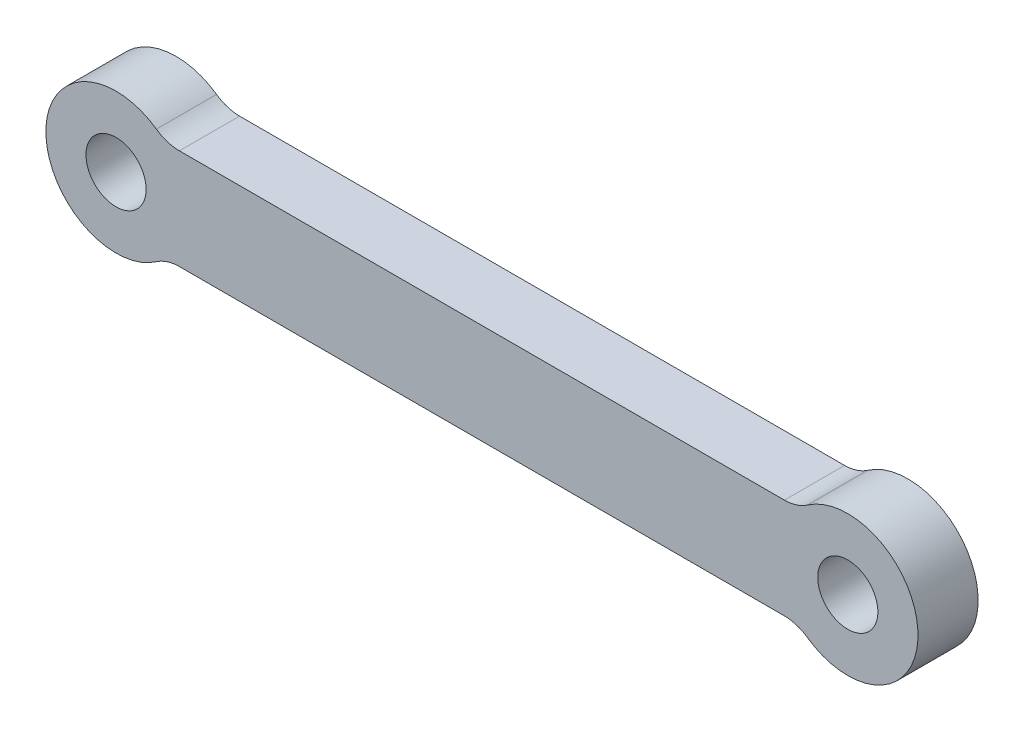
ISO-10303-21;
HEADER;
FILE_DESCRIPTION(('STEP AP214'),'2;1');
FILE_NAME('part.step','',(''),(''),'','','');
FILE_SCHEMA(('AUTOMOTIVE_DESIGN { 1 0 10303 214 1 1 1 1 }'));
ENDSEC;
DATA;
#1=APPLICATION_CONTEXT('core data for automotive mechanical design processes');
#2=APPLICATION_PROTOCOL_DEFINITION('international standard','automotive_design',2000,#1);
#3=PRODUCT_CONTEXT('',#1,'mechanical');
#4=PRODUCT('Part','Part','',(#3));
#5=PRODUCT_RELATED_PRODUCT_CATEGORY('part','',(#4));
#6=PRODUCT_DEFINITION_FORMATION('','',#4);
#7=PRODUCT_DEFINITION_CONTEXT('part definition',#1,'design');
#8=PRODUCT_DEFINITION('design','',#6,#7);
#9=PRODUCT_DEFINITION_SHAPE('','',#8);
#10=(LENGTH_UNIT() NAMED_UNIT(*) SI_UNIT(.MILLI.,.METRE.));
#11=(NAMED_UNIT(*) PLANE_ANGLE_UNIT() SI_UNIT($,.RADIAN.));
#12=(NAMED_UNIT(*) SI_UNIT($,.STERADIAN.) SOLID_ANGLE_UNIT());
#13=UNCERTAINTY_MEASURE_WITH_UNIT(LENGTH_MEASURE(1.E-05),#10,'distance_accuracy_value','');
#14=(GEOMETRIC_REPRESENTATION_CONTEXT(3) GLOBAL_UNCERTAINTY_ASSIGNED_CONTEXT((#13)) GLOBAL_UNIT_ASSIGNED_CONTEXT((#10,
#11,#12)) REPRESENTATION_CONTEXT('',''));
#15=CARTESIAN_POINT('',(0.,0.,0.));
#16=DIRECTION('',(0.,0.,1.));
#17=DIRECTION('',(1.,0.,0.));
#18=AXIS2_PLACEMENT_3D('',#15,#16,#17);
#19=CARTESIAN_POINT('',(33.3377223398316,-4.5,3.));
#20=DIRECTION('',(0.,0.,-1.));
#21=DIRECTION('',(-1.,0.,0.));
#22=AXIS2_PLACEMENT_3D('',#19,#20,#21);
#23=PLANE('',#22);
#24=CARTESIAN_POINT('',(33.3377223398316,-4.5,3.));
#25=DIRECTION('',(0.,0.,-1.));
#26=DIRECTION('',(-1.,0.,0.));
#27=AXIS2_PLACEMENT_3D('',#24,#25,#26);
#28=CIRCLE('',#27,2.);
#29=CARTESIAN_POINT('',(33.3377223398316,-2.5,3.));
#30=VERTEX_POINT('',#29);
#31=CARTESIAN_POINT('',(34.4876414889838,-2.86363636363636,3.));
#32=VERTEX_POINT('',#31);
#33=EDGE_CURVE('E146',#30,#32,#28,.T.);
#34=ORIENTED_EDGE('',*,*,#33,.T.);
#35=CARTESIAN_POINT('',(36.5,0.,3.));
#36=DIRECTION('',(0.,0.,1.));
#37=DIRECTION('',(-1.,0.,0.));
#38=AXIS2_PLACEMENT_3D('',#35,#36,#37);
#39=CIRCLE('',#38,3.5);
#40=CARTESIAN_POINT('',(34.4876414889838,2.86363636363637,3.));
#41=VERTEX_POINT('',#40);
#42=EDGE_CURVE('E94',#32,#41,#39,.T.);
#43=ORIENTED_EDGE('',*,*,#42,.T.);
#44=CARTESIAN_POINT('',(33.3377223398316,4.5,3.));
#45=DIRECTION('',(0.,0.,-1.));
#46=DIRECTION('',(-1.,0.,0.));
#47=AXIS2_PLACEMENT_3D('',#44,#45,#46);
#48=CIRCLE('',#47,1.99999999999999);
#49=CARTESIAN_POINT('',(33.3377223398316,2.5,3.));
#50=VERTEX_POINT('',#49);
#51=EDGE_CURVE('E161',#41,#50,#48,.T.);
#52=ORIENTED_EDGE('',*,*,#51,.T.);
#53=DIRECTION('',(-1.,0.,0.));
#54=VECTOR('',#53,1.);
#55=CARTESIAN_POINT('',(3.16227766016838,2.5,3.));
#56=LINE('',#55,#54);
#57=CARTESIAN_POINT('',(3.16227766016838,2.5,3.));
#58=VERTEX_POINT('',#57);
#59=EDGE_CURVE('E174',#50,#58,#56,.T.);
#60=ORIENTED_EDGE('',*,*,#59,.T.);
#61=CARTESIAN_POINT('',(3.16227766016838,4.5,3.));
#62=DIRECTION('',(0.,0.,-1.));
#63=DIRECTION('',(-1.,0.,0.));
#64=AXIS2_PLACEMENT_3D('',#61,#62,#63);
#65=CIRCLE('',#64,2.);
#66=CARTESIAN_POINT('',(2.01235851101624,2.86363636363636,3.));
#67=VERTEX_POINT('',#66);
#68=EDGE_CURVE('E113',#58,#67,#65,.T.);
#69=ORIENTED_EDGE('',*,*,#68,.T.);
#70=CARTESIAN_POINT('',(0.,0.,3.));
#71=DIRECTION('',(0.,0.,1.));
#72=DIRECTION('',(1.,0.,0.));
#73=AXIS2_PLACEMENT_3D('',#70,#71,#72);
#74=CIRCLE('',#73,3.5);
#75=CARTESIAN_POINT('',(2.01235851101624,-2.86363636363636,3.));
#76=VERTEX_POINT('',#75);
#77=EDGE_CURVE('E107',#67,#76,#74,.T.);
#78=ORIENTED_EDGE('',*,*,#77,.T.);
#79=CARTESIAN_POINT('',(3.16227766016838,-4.5,3.));
#80=DIRECTION('',(0.,0.,-1.));
#81=DIRECTION('',(1.,0.,0.));
#82=AXIS2_PLACEMENT_3D('',#79,#80,#81);
#83=CIRCLE('',#82,2.);
#84=CARTESIAN_POINT('',(3.16227766016838,-2.5,3.));
#85=VERTEX_POINT('',#84);
#86=EDGE_CURVE('E111',#76,#85,#83,.T.);
#87=ORIENTED_EDGE('',*,*,#86,.T.);
#88=DIRECTION('',(1.,0.,0.));
#89=VECTOR('',#88,1.);
#90=CARTESIAN_POINT('',(3.16227766016838,-2.5,3.));
#91=LINE('',#90,#89);
#92=EDGE_CURVE('E51',#85,#30,#91,.T.);
#93=ORIENTED_EDGE('',*,*,#92,.T.);
#94=EDGE_LOOP('',(#34,#43,#52,#60,#69,#78,#87,#93));
#95=FACE_BOUND('',#94,.T.);
#96=CARTESIAN_POINT('',(0.,0.,3.));
#97=DIRECTION('',(0.,0.,1.));
#98=DIRECTION('',(1.,0.,0.));
#99=AXIS2_PLACEMENT_3D('',#96,#97,#98);
#100=CIRCLE('',#99,1.5);
#101=CARTESIAN_POINT('',(1.5,0.,3.));
#102=VERTEX_POINT('',#101);
#103=EDGE_CURVE('E135',#102,#102,#100,.T.);
#104=ORIENTED_EDGE('',*,*,#103,.F.);
#105=EDGE_LOOP('',(#104));
#106=FACE_BOUND('',#105,.T.);
#107=CARTESIAN_POINT('',(36.5,0.,3.));
#108=DIRECTION('',(0.,0.,1.));
#109=DIRECTION('',(1.,0.,0.));
#110=AXIS2_PLACEMENT_3D('',#107,#108,#109);
#111=CIRCLE('',#110,1.5);
#112=CARTESIAN_POINT('',(38.,0.,3.));
#113=VERTEX_POINT('',#112);
#114=EDGE_CURVE('E183',#113,#113,#111,.T.);
#115=ORIENTED_EDGE('',*,*,#114,.F.);
#116=EDGE_LOOP('',(#115));
#117=FACE_BOUND('',#116,.T.);
#118=ADVANCED_FACE('F34',(#95,#106,#117),#23,.F.);
#119=CARTESIAN_POINT('',(33.3377223398316,-4.5,0.));
#120=DIRECTION('',(0.,0.,-1.));
#121=DIRECTION('',(-1.,0.,0.));
#122=AXIS2_PLACEMENT_3D('',#119,#120,#121);
#123=PLANE('',#122);
#124=CARTESIAN_POINT('',(0.,0.,0.));
#125=DIRECTION('',(0.,0.,1.));
#126=DIRECTION('',(1.,0.,0.));
#127=AXIS2_PLACEMENT_3D('',#124,#125,#126);
#128=CIRCLE('',#127,1.5);
#129=CARTESIAN_POINT('',(1.5,0.,0.));
#130=VERTEX_POINT('',#129);
#131=EDGE_CURVE('E180',#130,#130,#128,.T.);
#132=ORIENTED_EDGE('',*,*,#131,.T.);
#133=EDGE_LOOP('',(#132));
#134=FACE_BOUND('',#133,.T.);
#135=CARTESIAN_POINT('',(33.3377223398316,-4.5,0.));
#136=DIRECTION('',(0.,0.,-1.));
#137=DIRECTION('',(-1.,0.,0.));
#138=AXIS2_PLACEMENT_3D('',#135,#136,#137);
#139=CIRCLE('',#138,2.);
#140=CARTESIAN_POINT('',(33.3377223398316,-2.5,0.));
#141=VERTEX_POINT('',#140);
#142=CARTESIAN_POINT('',(34.4876414889838,-2.86363636363636,0.));
#143=VERTEX_POINT('',#142);
#144=EDGE_CURVE('E131',#141,#143,#139,.T.);
#145=ORIENTED_EDGE('',*,*,#144,.F.);
#146=DIRECTION('',(1.,0.,0.));
#147=VECTOR('',#146,1.);
#148=CARTESIAN_POINT('',(3.16227766016838,-2.5,0.));
#149=LINE('',#148,#147);
#150=CARTESIAN_POINT('',(3.16227766016838,-2.5,0.));
#151=VERTEX_POINT('',#150);
#152=EDGE_CURVE('E86',#151,#141,#149,.T.);
#153=ORIENTED_EDGE('',*,*,#152,.F.);
#154=CARTESIAN_POINT('',(3.16227766016838,-4.5,0.));
#155=DIRECTION('',(0.,0.,-1.));
#156=DIRECTION('',(1.,0.,0.));
#157=AXIS2_PLACEMENT_3D('',#154,#155,#156);
#158=CIRCLE('',#157,2.);
#159=CARTESIAN_POINT('',(2.01235851101624,-2.86363636363636,0.));
#160=VERTEX_POINT('',#159);
#161=EDGE_CURVE('E80',#160,#151,#158,.T.);
#162=ORIENTED_EDGE('',*,*,#161,.F.);
#163=CARTESIAN_POINT('',(0.,0.,0.));
#164=DIRECTION('',(0.,0.,1.));
#165=DIRECTION('',(1.,0.,0.));
#166=AXIS2_PLACEMENT_3D('',#163,#164,#165);
#167=CIRCLE('',#166,3.5);
#168=CARTESIAN_POINT('',(2.01235851101624,2.86363636363636,0.));
#169=VERTEX_POINT('',#168);
#170=EDGE_CURVE('E121',#169,#160,#167,.T.);
#171=ORIENTED_EDGE('',*,*,#170,.F.);
#172=CARTESIAN_POINT('',(3.16227766016838,4.5,0.));
#173=DIRECTION('',(0.,0.,-1.));
#174=DIRECTION('',(-1.,0.,0.));
#175=AXIS2_PLACEMENT_3D('',#172,#173,#174);
#176=CIRCLE('',#175,2.);
#177=CARTESIAN_POINT('',(3.16227766016838,2.5,0.));
#178=VERTEX_POINT('',#177);
#179=EDGE_CURVE('E141',#178,#169,#176,.T.);
#180=ORIENTED_EDGE('',*,*,#179,.F.);
#181=DIRECTION('',(-1.,0.,0.));
#182=VECTOR('',#181,1.);
#183=CARTESIAN_POINT('',(3.16227766016838,2.5,0.));
#184=LINE('',#183,#182);
#185=CARTESIAN_POINT('',(33.3377223398316,2.5,0.));
#186=VERTEX_POINT('',#185);
#187=EDGE_CURVE('E139',#186,#178,#184,.T.);
#188=ORIENTED_EDGE('',*,*,#187,.F.);
#189=CARTESIAN_POINT('',(33.3377223398316,4.5,0.));
#190=DIRECTION('',(0.,0.,-1.));
#191=DIRECTION('',(-1.,0.,0.));
#192=AXIS2_PLACEMENT_3D('',#189,#190,#191);
#193=CIRCLE('',#192,1.99999999999999);
#194=CARTESIAN_POINT('',(34.4876414889838,2.86363636363637,0.));
#195=VERTEX_POINT('',#194);
#196=EDGE_CURVE('E137',#195,#186,#193,.T.);
#197=ORIENTED_EDGE('',*,*,#196,.F.);
#198=CARTESIAN_POINT('',(36.5,0.,0.));
#199=DIRECTION('',(0.,0.,1.));
#200=DIRECTION('',(-1.,0.,0.));
#201=AXIS2_PLACEMENT_3D('',#198,#199,#200);
#202=CIRCLE('',#201,3.5);
#203=EDGE_CURVE('E134',#143,#195,#202,.T.);
#204=ORIENTED_EDGE('',*,*,#203,.F.);
#205=EDGE_LOOP('',(#145,#153,#162,#171,#180,#188,#197,#204));
#206=FACE_BOUND('',#205,.T.);
#207=CARTESIAN_POINT('',(36.5,0.,0.));
#208=DIRECTION('',(0.,0.,1.));
#209=DIRECTION('',(1.,0.,0.));
#210=AXIS2_PLACEMENT_3D('',#207,#208,#209);
#211=CIRCLE('',#210,1.5);
#212=CARTESIAN_POINT('',(38.,0.,0.));
#213=VERTEX_POINT('',#212);
#214=EDGE_CURVE('E186',#213,#213,#211,.T.);
#215=ORIENTED_EDGE('',*,*,#214,.T.);
#216=EDGE_LOOP('',(#215));
#217=FACE_BOUND('',#216,.T.);
#218=ADVANCED_FACE('F165',(#134,#206,#217),#123,.T.);
#219=CARTESIAN_POINT('',(33.3377223398316,-4.5,3.));
#220=DIRECTION('',(0.,0.,-1.));
#221=DIRECTION('',(-1.,0.,0.));
#222=AXIS2_PLACEMENT_3D('',#219,#220,#221);
#223=CYLINDRICAL_SURFACE('',#222,2.);
#224=ORIENTED_EDGE('',*,*,#144,.T.);
#225=DIRECTION('',(0.,0.,-1.));
#226=VECTOR('',#225,1.);
#227=CARTESIAN_POINT('',(34.4876414889838,-2.86363636363636,3.));
#228=LINE('',#227,#226);
#229=EDGE_CURVE('E11',#32,#143,#228,.T.);
#230=ORIENTED_EDGE('',*,*,#229,.F.);
#231=ORIENTED_EDGE('',*,*,#33,.F.);
#232=DIRECTION('',(0.,0.,-1.));
#233=VECTOR('',#232,1.);
#234=CARTESIAN_POINT('',(33.3377223398316,-2.5,3.));
#235=LINE('',#234,#233);
#236=EDGE_CURVE('E127',#30,#141,#235,.T.);
#237=ORIENTED_EDGE('',*,*,#236,.T.);
#238=EDGE_LOOP('',(#224,#230,#231,#237));
#239=FACE_BOUND('',#238,.T.);
#240=ADVANCED_FACE('F36',(#239),#223,.F.);
#241=CARTESIAN_POINT('',(36.5,0.,3.));
#242=DIRECTION('',(0.,0.,-1.));
#243=DIRECTION('',(-1.,0.,0.));
#244=AXIS2_PLACEMENT_3D('',#241,#242,#243);
#245=CYLINDRICAL_SURFACE('',#244,3.5);
#246=ORIENTED_EDGE('',*,*,#203,.T.);
#247=DIRECTION('',(0.,0.,-1.));
#248=VECTOR('',#247,1.);
#249=CARTESIAN_POINT('',(34.4876414889838,2.86363636363637,3.));
#250=LINE('',#249,#248);
#251=EDGE_CURVE('E43',#41,#195,#250,.T.);
#252=ORIENTED_EDGE('',*,*,#251,.F.);
#253=ORIENTED_EDGE('',*,*,#42,.F.);
#254=ORIENTED_EDGE('',*,*,#229,.T.);
#255=EDGE_LOOP('',(#246,#252,#253,#254));
#256=FACE_BOUND('',#255,.T.);
#257=ADVANCED_FACE('F218',(#256),#245,.T.);
#258=CARTESIAN_POINT('',(33.3377223398316,4.5,3.));
#259=DIRECTION('',(0.,0.,-1.));
#260=DIRECTION('',(-1.,0.,0.));
#261=AXIS2_PLACEMENT_3D('',#258,#259,#260);
#262=CYLINDRICAL_SURFACE('',#261,1.99999999999999);
#263=ORIENTED_EDGE('',*,*,#196,.T.);
#264=DIRECTION('',(0.,0.,-1.));
#265=VECTOR('',#264,1.);
#266=CARTESIAN_POINT('',(33.3377223398316,2.5,3.));
#267=LINE('',#266,#265);
#268=EDGE_CURVE('E153',#50,#186,#267,.T.);
#269=ORIENTED_EDGE('',*,*,#268,.F.);
#270=ORIENTED_EDGE('',*,*,#51,.F.);
#271=ORIENTED_EDGE('',*,*,#251,.T.);
#272=EDGE_LOOP('',(#263,#269,#270,#271));
#273=FACE_BOUND('',#272,.T.);
#274=ADVANCED_FACE('F159',(#273),#262,.F.);
#275=CARTESIAN_POINT('',(3.16227766016838,2.5,3.));
#276=DIRECTION('',(0.,-1.,0.));
#277=DIRECTION('',(1.,0.,0.));
#278=AXIS2_PLACEMENT_3D('',#275,#276,#277);
#279=PLANE('',#278);
#280=ORIENTED_EDGE('',*,*,#187,.T.);
#281=DIRECTION('',(0.,0.,-1.));
#282=VECTOR('',#281,1.);
#283=CARTESIAN_POINT('',(3.16227766016838,2.5,3.));
#284=LINE('',#283,#282);
#285=EDGE_CURVE('E150',#58,#178,#284,.T.);
#286=ORIENTED_EDGE('',*,*,#285,.F.);
#287=ORIENTED_EDGE('',*,*,#59,.F.);
#288=ORIENTED_EDGE('',*,*,#268,.T.);
#289=EDGE_LOOP('',(#280,#286,#287,#288));
#290=FACE_BOUND('',#289,.T.);
#291=ADVANCED_FACE('F170',(#290),#279,.F.);
#292=CARTESIAN_POINT('',(3.16227766016838,4.5,3.));
#293=DIRECTION('',(0.,0.,-1.));
#294=DIRECTION('',(-1.,0.,0.));
#295=AXIS2_PLACEMENT_3D('',#292,#293,#294);
#296=CYLINDRICAL_SURFACE('',#295,2.);
#297=ORIENTED_EDGE('',*,*,#179,.T.);
#298=DIRECTION('',(0.,0.,-1.));
#299=VECTOR('',#298,1.);
#300=CARTESIAN_POINT('',(2.01235851101624,2.86363636363636,3.));
#301=LINE('',#300,#299);
#302=EDGE_CURVE('E122',#67,#169,#301,.T.);
#303=ORIENTED_EDGE('',*,*,#302,.F.);
#304=ORIENTED_EDGE('',*,*,#68,.F.);
#305=ORIENTED_EDGE('',*,*,#285,.T.);
#306=EDGE_LOOP('',(#297,#303,#304,#305));
#307=FACE_BOUND('',#306,.T.);
#308=ADVANCED_FACE('F173',(#307),#296,.F.);
#309=CARTESIAN_POINT('',(0.,0.,3.));
#310=DIRECTION('',(0.,0.,-1.));
#311=DIRECTION('',(-1.,0.,0.));
#312=AXIS2_PLACEMENT_3D('',#309,#310,#311);
#313=CYLINDRICAL_SURFACE('',#312,3.5);
#314=ORIENTED_EDGE('',*,*,#170,.T.);
#315=DIRECTION('',(0.,0.,-1.));
#316=VECTOR('',#315,1.);
#317=CARTESIAN_POINT('',(2.01235851101624,-2.86363636363636,3.));
#318=LINE('',#317,#316);
#319=EDGE_CURVE('E118',#76,#160,#318,.T.);
#320=ORIENTED_EDGE('',*,*,#319,.F.);
#321=ORIENTED_EDGE('',*,*,#77,.F.);
#322=ORIENTED_EDGE('',*,*,#302,.T.);
#323=EDGE_LOOP('',(#314,#320,#321,#322));
#324=FACE_BOUND('',#323,.T.);
#325=ADVANCED_FACE('F119',(#324),#313,.T.);
#326=CARTESIAN_POINT('',(3.16227766016838,-4.5,3.));
#327=DIRECTION('',(0.,0.,-1.));
#328=DIRECTION('',(-1.,0.,0.));
#329=AXIS2_PLACEMENT_3D('',#326,#327,#328);
#330=CYLINDRICAL_SURFACE('',#329,2.);
#331=ORIENTED_EDGE('',*,*,#161,.T.);
#332=DIRECTION('',(0.,0.,-1.));
#333=VECTOR('',#332,1.);
#334=CARTESIAN_POINT('',(3.16227766016838,-2.5,3.));
#335=LINE('',#334,#333);
#336=EDGE_CURVE('E123',#85,#151,#335,.T.);
#337=ORIENTED_EDGE('',*,*,#336,.F.);
#338=ORIENTED_EDGE('',*,*,#86,.F.);
#339=ORIENTED_EDGE('',*,*,#319,.T.);
#340=EDGE_LOOP('',(#331,#337,#338,#339));
#341=FACE_BOUND('',#340,.T.);
#342=ADVANCED_FACE('F125',(#341),#330,.F.);
#343=CARTESIAN_POINT('',(3.16227766016838,-2.5,3.));
#344=DIRECTION('',(0.,1.,0.));
#345=DIRECTION('',(-1.,0.,0.));
#346=AXIS2_PLACEMENT_3D('',#343,#344,#345);
#347=PLANE('',#346);
#348=ORIENTED_EDGE('',*,*,#152,.T.);
#349=ORIENTED_EDGE('',*,*,#236,.F.);
#350=ORIENTED_EDGE('',*,*,#92,.F.);
#351=ORIENTED_EDGE('',*,*,#336,.T.);
#352=EDGE_LOOP('',(#348,#349,#350,#351));
#353=FACE_BOUND('',#352,.T.);
#354=ADVANCED_FACE('F206',(#353),#347,.F.);
#355=CARTESIAN_POINT('',(0.,0.,3.));
#356=DIRECTION('',(0.,0.,-1.));
#357=DIRECTION('',(-1.,0.,0.));
#358=AXIS2_PLACEMENT_3D('',#355,#356,#357);
#359=CYLINDRICAL_SURFACE('',#358,1.5);
#360=ORIENTED_EDGE('',*,*,#103,.T.);
#361=EDGE_LOOP('',(#360));
#362=FACE_BOUND('',#361,.T.);
#363=ORIENTED_EDGE('',*,*,#131,.F.);
#364=EDGE_LOOP('',(#363));
#365=FACE_BOUND('',#364,.T.);
#366=ADVANCED_FACE('F203',(#362,#365),#359,.F.);
#367=CARTESIAN_POINT('',(36.5,0.,3.));
#368=DIRECTION('',(0.,0.,-1.));
#369=DIRECTION('',(-1.,0.,0.));
#370=AXIS2_PLACEMENT_3D('',#367,#368,#369);
#371=CYLINDRICAL_SURFACE('',#370,1.5);
#372=ORIENTED_EDGE('',*,*,#114,.T.);
#373=EDGE_LOOP('',(#372));
#374=FACE_BOUND('',#373,.T.);
#375=ORIENTED_EDGE('',*,*,#214,.F.);
#376=EDGE_LOOP('',(#375));
#377=FACE_BOUND('',#376,.T.);
#378=ADVANCED_FACE('F192',(#374,#377),#371,.F.);
#379=CLOSED_SHELL('',(#118,#218,#240,#257,#274,#291,#308,#325,#342,#354,#366,#378));
#380=MANIFOLD_SOLID_BREP('B2',#379);
#381=ADVANCED_BREP_SHAPE_REPRESENTATION('',(#18,#380),#14);
#382=SHAPE_DEFINITION_REPRESENTATION(#9,#381);
ENDSEC;
END-ISO-10303-21;
